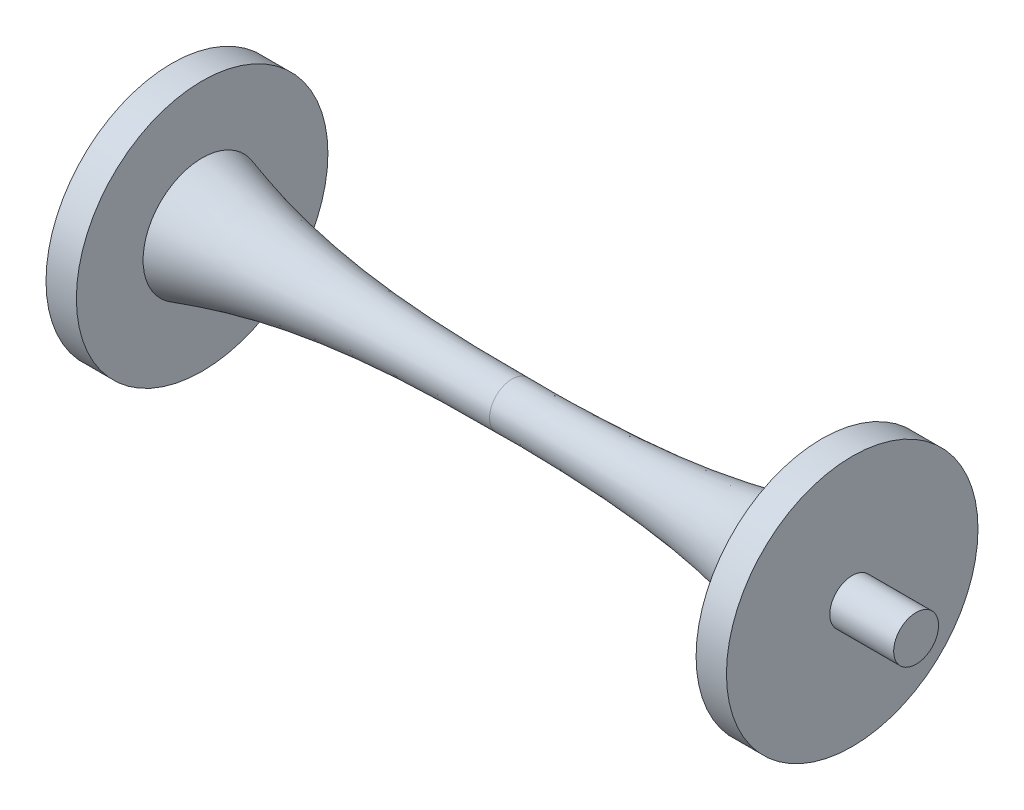
ISO-10303-21;
HEADER;
FILE_DESCRIPTION(('STEP AP214'),'2;1');
FILE_NAME('part.step','',(''),(''),'','','');
FILE_SCHEMA(('AUTOMOTIVE_DESIGN { 1 0 10303 214 1 1 1 1 }'));
ENDSEC;
DATA;
#1=APPLICATION_CONTEXT('core data for automotive mechanical design processes');
#2=APPLICATION_PROTOCOL_DEFINITION('international standard','automotive_design',2000,#1);
#3=PRODUCT_CONTEXT('',#1,'mechanical');
#4=PRODUCT('Part','Part','',(#3));
#5=PRODUCT_RELATED_PRODUCT_CATEGORY('part','',(#4));
#6=PRODUCT_DEFINITION_FORMATION('','',#4);
#7=PRODUCT_DEFINITION_CONTEXT('part definition',#1,'design');
#8=PRODUCT_DEFINITION('design','',#6,#7);
#9=PRODUCT_DEFINITION_SHAPE('','',#8);
#10=(LENGTH_UNIT() NAMED_UNIT(*) SI_UNIT(.MILLI.,.METRE.));
#11=(NAMED_UNIT(*) PLANE_ANGLE_UNIT() SI_UNIT($,.RADIAN.));
#12=(NAMED_UNIT(*) SI_UNIT($,.STERADIAN.) SOLID_ANGLE_UNIT());
#13=UNCERTAINTY_MEASURE_WITH_UNIT(LENGTH_MEASURE(1.E-05),#10,'distance_accuracy_value','');
#14=(GEOMETRIC_REPRESENTATION_CONTEXT(3) GLOBAL_UNCERTAINTY_ASSIGNED_CONTEXT((#13)) GLOBAL_UNIT_ASSIGNED_CONTEXT((#10,
#11,#12)) REPRESENTATION_CONTEXT('',''));
#15=CARTESIAN_POINT('',(0.,0.,0.));
#16=DIRECTION('',(0.,0.,1.));
#17=DIRECTION('',(1.,0.,0.));
#18=AXIS2_PLACEMENT_3D('',#15,#16,#17);
#19=CARTESIAN_POINT('',(45.538342679702,0.,-8.67800316556029));
#20=CARTESIAN_POINT('',(42.9360888311399,0.,-7.87624003759127));
#21=CARTESIAN_POINT('',(28.3527495927119,0.,-3.96438850704222));
#22=CARTESIAN_POINT('',(14.1343081115229,0.,-3.24783854324355));
#23=CARTESIAN_POINT('',(0.,0.,-3.29949238578681));
#24=B_SPLINE_CURVE_WITH_KNOTS('',3,(#19,#20,#21,#22,#23),.UNSPECIFIED.,.F.,.F.,(4,1,4),(0.,
0.159956346302514,0.909412715386676),.UNSPECIFIED.);
#25=CARTESIAN_POINT('',(0.,0.,0.));
#26=DIRECTION('',(1.,0.,0.));
#27=AXIS1_PLACEMENT('',#25,#26);
#28=SURFACE_OF_REVOLUTION('',#24,#27);
#29=CARTESIAN_POINT('',(0.,0.,0.));
#30=DIRECTION('',(1.,0.,0.));
#31=DIRECTION('',(0.,0.,-1.));
#32=AXIS2_PLACEMENT_3D('',#29,#30,#31);
#33=CIRCLE('',#32,3.29949238578681);
#34=CARTESIAN_POINT('',(0.,0.,-3.29949238578681));
#35=VERTEX_POINT('',#34);
#36=EDGE_CURVE('E69',#35,#35,#33,.T.);
#37=ORIENTED_EDGE('',*,*,#36,.T.);
#38=EDGE_LOOP('',(#37));
#39=FACE_BOUND('',#38,.T.);
#40=CARTESIAN_POINT('',(45.538342679702,0.,0.));
#41=DIRECTION('',(1.,0.,0.));
#42=DIRECTION('',(0.,0.,-1.));
#43=AXIS2_PLACEMENT_3D('',#40,#41,#42);
#44=CIRCLE('',#43,8.67800316556029);
#45=CARTESIAN_POINT('',(45.538342679702,0.,-8.67800316556029));
#46=VERTEX_POINT('',#45);
#47=EDGE_CURVE('E10',#46,#46,#44,.T.);
#48=ORIENTED_EDGE('',*,*,#47,.F.);
#49=EDGE_LOOP('',(#48));
#50=FACE_BOUND('',#49,.T.);
#51=ADVANCED_FACE('F31',(#39,#50),#28,.F.);
#52=CARTESIAN_POINT('',(45.538342679702,0.,-18.4843797621045));
#53=DIRECTION('',(-1.,0.,0.));
#54=DIRECTION('',(0.,0.,1.));
#55=AXIS2_PLACEMENT_3D('',#52,#53,#54);
#56=PLANE('',#55);
#57=ORIENTED_EDGE('',*,*,#47,.T.);
#58=EDGE_LOOP('',(#57));
#59=FACE_BOUND('',#58,.T.);
#60=CARTESIAN_POINT('',(45.538342679702,0.,0.));
#61=DIRECTION('',(1.,0.,0.));
#62=DIRECTION('',(0.,0.,-1.));
#63=AXIS2_PLACEMENT_3D('',#60,#61,#62);
#64=CIRCLE('',#63,18.4843797621045);
#65=CARTESIAN_POINT('',(45.538342679702,0.,-18.4843797621045));
#66=VERTEX_POINT('',#65);
#67=EDGE_CURVE('E38',#66,#66,#64,.T.);
#68=ORIENTED_EDGE('',*,*,#67,.F.);
#69=EDGE_LOOP('',(#68));
#70=FACE_BOUND('',#69,.T.);
#71=ADVANCED_FACE('F120',(#59,#70),#56,.T.);
#72=CARTESIAN_POINT('',(0.,0.,0.));
#73=DIRECTION('',(1.,0.,0.));
#74=DIRECTION('',(0.,0.,-1.));
#75=AXIS2_PLACEMENT_3D('',#72,#73,#74);
#76=CYLINDRICAL_SURFACE('',#75,18.4843797621045);
#77=ORIENTED_EDGE('',*,*,#67,.T.);
#78=EDGE_LOOP('',(#77));
#79=FACE_BOUND('',#78,.T.);
#80=CARTESIAN_POINT('',(50.,0.,0.));
#81=DIRECTION('',(1.,0.,0.));
#82=DIRECTION('',(0.,0.,-1.));
#83=AXIS2_PLACEMENT_3D('',#80,#81,#82);
#84=CIRCLE('',#83,18.4843797621045);
#85=CARTESIAN_POINT('',(50.,0.,-18.4843797621045));
#86=VERTEX_POINT('',#85);
#87=EDGE_CURVE('E42',#86,#86,#84,.T.);
#88=ORIENTED_EDGE('',*,*,#87,.F.);
#89=EDGE_LOOP('',(#88));
#90=FACE_BOUND('',#89,.T.);
#91=ADVANCED_FACE('F117',(#79,#90),#76,.T.);
#92=CARTESIAN_POINT('',(50.,0.,-10.1522842639594));
#93=DIRECTION('',(1.,0.,0.));
#94=DIRECTION('',(0.,0.,-1.));
#95=AXIS2_PLACEMENT_3D('',#92,#93,#94);
#96=PLANE('',#95);
#97=ORIENTED_EDGE('',*,*,#87,.T.);
#98=EDGE_LOOP('',(#97));
#99=FACE_BOUND('',#98,.T.);
#100=CARTESIAN_POINT('',(50.,0.,0.));
#101=DIRECTION('',(1.,0.,0.));
#102=DIRECTION('',(0.,0.,-1.));
#103=AXIS2_PLACEMENT_3D('',#100,#101,#102);
#104=CIRCLE('',#103,3.29949238578681);
#105=CARTESIAN_POINT('',(50.,0.,-3.29949238578681));
#106=VERTEX_POINT('',#105);
#107=EDGE_CURVE('E46',#106,#106,#104,.T.);
#108=ORIENTED_EDGE('',*,*,#107,.F.);
#109=EDGE_LOOP('',(#108));
#110=FACE_BOUND('',#109,.T.);
#111=ADVANCED_FACE('F113',(#99,#110),#96,.T.);
#112=CARTESIAN_POINT('',(0.,0.,0.));
#113=DIRECTION('',(1.,0.,0.));
#114=DIRECTION('',(0.,0.,-1.));
#115=AXIS2_PLACEMENT_3D('',#112,#113,#114);
#116=CYLINDRICAL_SURFACE('',#115,3.29949238578681);
#117=ORIENTED_EDGE('',*,*,#107,.T.);
#118=EDGE_LOOP('',(#117));
#119=FACE_BOUND('',#118,.T.);
#120=CARTESIAN_POINT('',(59.3908629441624,0.,0.));
#121=DIRECTION('',(1.,0.,0.));
#122=DIRECTION('',(0.,0.,-1.));
#123=AXIS2_PLACEMENT_3D('',#120,#121,#122);
#124=CIRCLE('',#123,3.29949238578681);
#125=CARTESIAN_POINT('',(59.3908629441624,0.,-3.29949238578681));
#126=VERTEX_POINT('',#125);
#127=EDGE_CURVE('E51',#126,#126,#124,.T.);
#128=ORIENTED_EDGE('',*,*,#127,.F.);
#129=EDGE_LOOP('',(#128));
#130=FACE_BOUND('',#129,.T.);
#131=ADVANCED_FACE('F109',(#119,#130),#116,.T.);
#132=CARTESIAN_POINT('',(59.3908629441624,0.,0.));
#133=DIRECTION('',(1.,0.,0.));
#134=DIRECTION('',(0.,0.,-1.));
#135=AXIS2_PLACEMENT_3D('',#132,#133,#134);
#136=PLANE('',#135);
#137=ORIENTED_EDGE('',*,*,#127,.T.);
#138=EDGE_LOOP('',(#137));
#139=FACE_BOUND('',#138,.T.);
#140=ADVANCED_FACE('F105',(#139),#136,.T.);
#141=CARTESIAN_POINT('',(-59.3908629441624,0.,-3.29949238578681));
#142=DIRECTION('',(-1.,0.,0.));
#143=DIRECTION('',(0.,0.,1.));
#144=AXIS2_PLACEMENT_3D('',#141,#142,#143);
#145=PLANE('',#144);
#146=CARTESIAN_POINT('',(-59.3908629441624,0.,0.));
#147=DIRECTION('',(1.,0.,0.));
#148=DIRECTION('',(0.,0.,-1.));
#149=AXIS2_PLACEMENT_3D('',#146,#147,#148);
#150=CIRCLE('',#149,3.29949238578681);
#151=CARTESIAN_POINT('',(-59.3908629441624,0.,-3.29949238578681));
#152=VERTEX_POINT('',#151);
#153=EDGE_CURVE('E54',#152,#152,#150,.T.);
#154=ORIENTED_EDGE('',*,*,#153,.F.);
#155=EDGE_LOOP('',(#154));
#156=FACE_BOUND('',#155,.T.);
#157=ADVANCED_FACE('F101',(#156),#145,.T.);
#158=CARTESIAN_POINT('',(0.,0.,0.));
#159=DIRECTION('',(1.,0.,0.));
#160=DIRECTION('',(0.,0.,-1.));
#161=AXIS2_PLACEMENT_3D('',#158,#159,#160);
#162=CYLINDRICAL_SURFACE('',#161,3.29949238578681);
#163=ORIENTED_EDGE('',*,*,#153,.T.);
#164=EDGE_LOOP('',(#163));
#165=FACE_BOUND('',#164,.T.);
#166=CARTESIAN_POINT('',(-50.,0.,0.));
#167=DIRECTION('',(1.,0.,0.));
#168=DIRECTION('',(0.,0.,-1.));
#169=AXIS2_PLACEMENT_3D('',#166,#167,#168);
#170=CIRCLE('',#169,3.29949238578681);
#171=CARTESIAN_POINT('',(-50.,0.,-3.29949238578681));
#172=VERTEX_POINT('',#171);
#173=EDGE_CURVE('E57',#172,#172,#170,.T.);
#174=ORIENTED_EDGE('',*,*,#173,.F.);
#175=EDGE_LOOP('',(#174));
#176=FACE_BOUND('',#175,.T.);
#177=ADVANCED_FACE('F97',(#165,#176),#162,.T.);
#178=CARTESIAN_POINT('',(-50.,0.,-10.1522842639594));
#179=DIRECTION('',(-1.,0.,0.));
#180=DIRECTION('',(0.,0.,1.));
#181=AXIS2_PLACEMENT_3D('',#178,#179,#180);
#182=PLANE('',#181);
#183=ORIENTED_EDGE('',*,*,#173,.T.);
#184=EDGE_LOOP('',(#183));
#185=FACE_BOUND('',#184,.T.);
#186=CARTESIAN_POINT('',(-50.,0.,0.));
#187=DIRECTION('',(1.,0.,0.));
#188=DIRECTION('',(0.,0.,-1.));
#189=AXIS2_PLACEMENT_3D('',#186,#187,#188);
#190=CIRCLE('',#189,18.4843797621045);
#191=CARTESIAN_POINT('',(-50.,0.,-18.4843797621045));
#192=VERTEX_POINT('',#191);
#193=EDGE_CURVE('E60',#192,#192,#190,.T.);
#194=ORIENTED_EDGE('',*,*,#193,.F.);
#195=EDGE_LOOP('',(#194));
#196=FACE_BOUND('',#195,.T.);
#197=ADVANCED_FACE('F93',(#185,#196),#182,.T.);
#198=CARTESIAN_POINT('',(0.,0.,0.));
#199=DIRECTION('',(1.,0.,0.));
#200=DIRECTION('',(0.,0.,-1.));
#201=AXIS2_PLACEMENT_3D('',#198,#199,#200);
#202=CYLINDRICAL_SURFACE('',#201,18.4843797621045);
#203=ORIENTED_EDGE('',*,*,#193,.T.);
#204=EDGE_LOOP('',(#203));
#205=FACE_BOUND('',#204,.T.);
#206=CARTESIAN_POINT('',(-45.538342679702,0.,0.));
#207=DIRECTION('',(1.,0.,0.));
#208=DIRECTION('',(0.,0.,-1.));
#209=AXIS2_PLACEMENT_3D('',#206,#207,#208);
#210=CIRCLE('',#209,18.4843797621045);
#211=CARTESIAN_POINT('',(-45.538342679702,0.,-18.4843797621045));
#212=VERTEX_POINT('',#211);
#213=EDGE_CURVE('E63',#212,#212,#210,.T.);
#214=ORIENTED_EDGE('',*,*,#213,.F.);
#215=EDGE_LOOP('',(#214));
#216=FACE_BOUND('',#215,.T.);
#217=ADVANCED_FACE('F89',(#205,#216),#202,.T.);
#218=CARTESIAN_POINT('',(-45.538342679702,0.,-18.4843797621045));
#219=DIRECTION('',(1.,0.,0.));
#220=DIRECTION('',(0.,0.,-1.));
#221=AXIS2_PLACEMENT_3D('',#218,#219,#220);
#222=PLANE('',#221);
#223=ORIENTED_EDGE('',*,*,#213,.T.);
#224=EDGE_LOOP('',(#223));
#225=FACE_BOUND('',#224,.T.);
#226=CARTESIAN_POINT('',(-45.538342679702,0.,0.));
#227=DIRECTION('',(1.,0.,0.));
#228=DIRECTION('',(0.,0.,-1.));
#229=AXIS2_PLACEMENT_3D('',#226,#227,#228);
#230=CIRCLE('',#229,8.67800316556029);
#231=CARTESIAN_POINT('',(-45.538342679702,0.,-8.67800316556029));
#232=VERTEX_POINT('',#231);
#233=EDGE_CURVE('E66',#232,#232,#230,.T.);
#234=ORIENTED_EDGE('',*,*,#233,.F.);
#235=EDGE_LOOP('',(#234));
#236=FACE_BOUND('',#235,.T.);
#237=ADVANCED_FACE('F85',(#225,#236),#222,.T.);
#238=CARTESIAN_POINT('',(0.,0.,-3.29949238578681));
#239=CARTESIAN_POINT('',(-14.1343081115229,0.,-3.24783854324355));
#240=CARTESIAN_POINT('',(-28.3527495924649,0.,-3.96438850697378));
#241=CARTESIAN_POINT('',(-42.9360888311717,0.,-7.8762400376035));
#242=CARTESIAN_POINT('',(-45.538342679702,0.,-8.67800316556029));
#243=B_SPLINE_CURVE_WITH_KNOTS('',3,(#238,#239,#240,#241,#242),.UNSPECIFIED.,.F.,.F.,(4,1,4),
(0.,0.749456369084162,0.909412715384775),.UNSPECIFIED.);
#244=CARTESIAN_POINT('',(0.,0.,0.));
#245=DIRECTION('',(1.,0.,0.));
#246=AXIS1_PLACEMENT('',#244,#245);
#247=SURFACE_OF_REVOLUTION('',#243,#246);
#248=ORIENTED_EDGE('',*,*,#233,.T.);
#249=EDGE_LOOP('',(#248));
#250=FACE_BOUND('',#249,.T.);
#251=ORIENTED_EDGE('',*,*,#36,.F.);
#252=EDGE_LOOP('',(#251));
#253=FACE_BOUND('',#252,.T.);
#254=ADVANCED_FACE('F82',(#250,#253),#247,.F.);
#255=CLOSED_SHELL('',(#51,#71,#91,#111,#131,#140,#157,#177,#197,#217,#237,#254));
#256=MANIFOLD_SOLID_BREP('B2',#255);
#257=ADVANCED_BREP_SHAPE_REPRESENTATION('',(#18,#256),#14);
#258=SHAPE_DEFINITION_REPRESENTATION(#9,#257);
ENDSEC;
END-ISO-10303-21;
